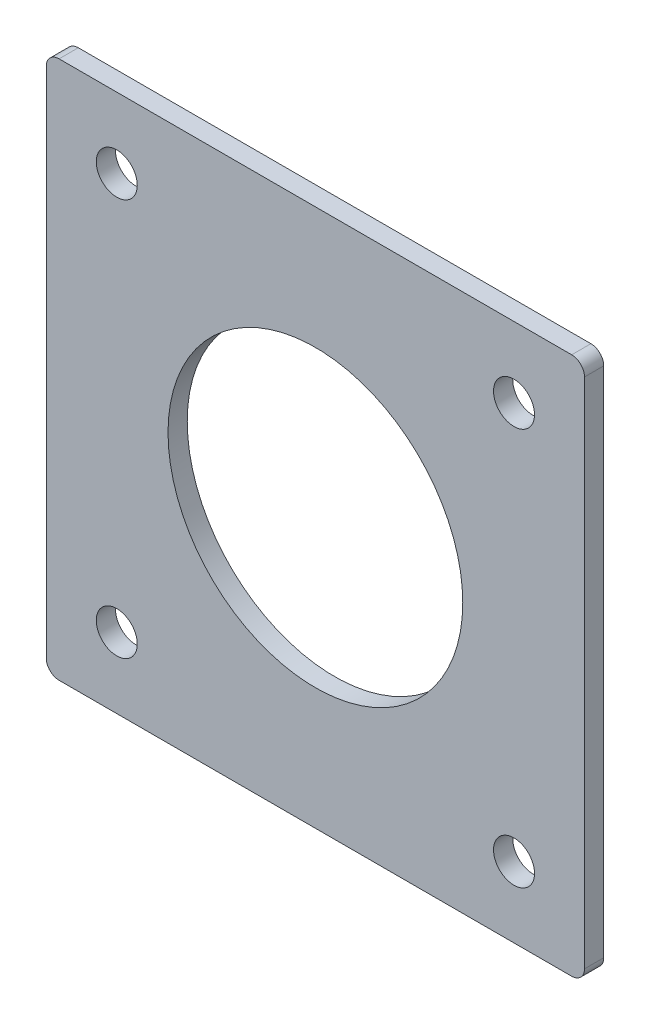
ISO-10303-21;
HEADER;
FILE_DESCRIPTION(('STEP AP214'),'2;1');
FILE_NAME('part.step','',(''),(''),'','','');
FILE_SCHEMA(('AUTOMOTIVE_DESIGN { 1 0 10303 214 1 1 1 1 }'));
ENDSEC;
DATA;
#1=APPLICATION_CONTEXT('core data for automotive mechanical design processes');
#2=APPLICATION_PROTOCOL_DEFINITION('international standard','automotive_design',2000,#1);
#3=PRODUCT_CONTEXT('',#1,'mechanical');
#4=PRODUCT('Part','Part','',(#3));
#5=PRODUCT_RELATED_PRODUCT_CATEGORY('part','',(#4));
#6=PRODUCT_DEFINITION_FORMATION('','',#4);
#7=PRODUCT_DEFINITION_CONTEXT('part definition',#1,'design');
#8=PRODUCT_DEFINITION('design','',#6,#7);
#9=PRODUCT_DEFINITION_SHAPE('','',#8);
#10=(LENGTH_UNIT() NAMED_UNIT(*) SI_UNIT(.MILLI.,.METRE.));
#11=(NAMED_UNIT(*) PLANE_ANGLE_UNIT() SI_UNIT($,.RADIAN.));
#12=(NAMED_UNIT(*) SI_UNIT($,.STERADIAN.) SOLID_ANGLE_UNIT());
#13=UNCERTAINTY_MEASURE_WITH_UNIT(LENGTH_MEASURE(1.E-05),#10,'distance_accuracy_value','');
#14=(GEOMETRIC_REPRESENTATION_CONTEXT(3) GLOBAL_UNCERTAINTY_ASSIGNED_CONTEXT((#13)) GLOBAL_UNIT_ASSIGNED_CONTEXT((#10,
#11,#12)) REPRESENTATION_CONTEXT('',''));
#15=CARTESIAN_POINT('',(0.,0.,0.));
#16=DIRECTION('',(0.,0.,1.));
#17=DIRECTION('',(1.,0.,0.));
#18=AXIS2_PLACEMENT_3D('',#15,#16,#17);
#19=CARTESIAN_POINT('',(0.,0.,1.5));
#20=DIRECTION('',(0.,0.,1.));
#21=DIRECTION('',(1.,0.,0.));
#22=AXIS2_PLACEMENT_3D('',#19,#20,#21);
#23=PLANE('',#22);
#24=CARTESIAN_POINT('',(-7.64179104477614,-10.0149253731343,1.5));
#25=DIRECTION('',(0.,0.,1.));
#26=DIRECTION('',(1.,0.,0.));
#27=AXIS2_PLACEMENT_3D('',#24,#25,#26);
#28=CIRCLE('',#27,1.6);
#29=CARTESIAN_POINT('',(-6.04179104477614,-10.0149253731343,1.5));
#30=VERTEX_POINT('',#29);
#31=EDGE_CURVE('E228',#30,#30,#28,.T.);
#32=ORIENTED_EDGE('',*,*,#31,.F.);
#33=EDGE_LOOP('',(#32));
#34=FACE_BOUND('',#33,.T.);
#35=CARTESIAN_POINT('',(-23.1417910447761,5.48507462686568,1.5));
#36=DIRECTION('',(0.,0.,1.));
#37=DIRECTION('',(1.,0.,0.));
#38=AXIS2_PLACEMENT_3D('',#35,#36,#37);
#39=CIRCLE('',#38,11.5);
#40=CARTESIAN_POINT('',(-11.6417910447761,5.48507462686568,1.5));
#41=VERTEX_POINT('',#40);
#42=EDGE_CURVE('E243',#41,#41,#39,.T.);
#43=ORIENTED_EDGE('',*,*,#42,.F.);
#44=EDGE_LOOP('',(#43));
#45=FACE_BOUND('',#44,.T.);
#46=DIRECTION('',(0.,-1.,0.));
#47=VECTOR('',#46,1.);
#48=CARTESIAN_POINT('',(-44.1417910447761,26.4850746268657,1.5));
#49=LINE('',#48,#47);
#50=CARTESIAN_POINT('',(-44.1417910447761,25.4850746268657,1.5));
#51=VERTEX_POINT('',#50);
#52=CARTESIAN_POINT('',(-44.1417910447761,-14.5149253731343,1.5));
#53=VERTEX_POINT('',#52);
#54=EDGE_CURVE('E148',#51,#53,#49,.T.);
#55=ORIENTED_EDGE('',*,*,#54,.T.);
#56=CARTESIAN_POINT('',(-43.1417910447761,-14.5149253731343,1.5));
#57=DIRECTION('',(0.,0.,1.));
#58=DIRECTION('',(1.,0.,0.));
#59=AXIS2_PLACEMENT_3D('',#56,#57,#58);
#60=CIRCLE('',#59,1.);
#61=CARTESIAN_POINT('',(-43.1417910447761,-15.5149253731343,1.5));
#62=VERTEX_POINT('',#61);
#63=EDGE_CURVE('E172',#53,#62,#60,.T.);
#64=ORIENTED_EDGE('',*,*,#63,.T.);
#65=DIRECTION('',(1.,0.,0.));
#66=VECTOR('',#65,1.);
#67=CARTESIAN_POINT('',(-44.1417910447761,-15.5149253731343,1.5));
#68=LINE('',#67,#66);
#69=CARTESIAN_POINT('',(-3.14179104477613,-15.5149253731343,1.5));
#70=VERTEX_POINT('',#69);
#71=EDGE_CURVE('E125',#62,#70,#68,.T.);
#72=ORIENTED_EDGE('',*,*,#71,.T.);
#73=CARTESIAN_POINT('',(-3.14179104477612,-14.5149253731343,1.5));
#74=DIRECTION('',(0.,0.,1.));
#75=DIRECTION('',(1.,0.,0.));
#76=AXIS2_PLACEMENT_3D('',#73,#74,#75);
#77=CIRCLE('',#76,1.);
#78=CARTESIAN_POINT('',(-2.14179104477612,-14.5149253731343,1.5));
#79=VERTEX_POINT('',#78);
#80=EDGE_CURVE('E169',#70,#79,#77,.T.);
#81=ORIENTED_EDGE('',*,*,#80,.T.);
#82=DIRECTION('',(0.,1.,0.));
#83=VECTOR('',#82,1.);
#84=CARTESIAN_POINT('',(-2.14179104477613,26.4850746268657,1.5));
#85=LINE('',#84,#83);
#86=CARTESIAN_POINT('',(-2.14179104477613,25.4850746268657,1.5));
#87=VERTEX_POINT('',#86);
#88=EDGE_CURVE('E198',#79,#87,#85,.T.);
#89=ORIENTED_EDGE('',*,*,#88,.T.);
#90=CARTESIAN_POINT('',(-3.14179104477613,25.4850746268657,1.5));
#91=DIRECTION('',(0.,0.,1.));
#92=DIRECTION('',(1.,0.,0.));
#93=AXIS2_PLACEMENT_3D('',#90,#91,#92);
#94=CIRCLE('',#93,1.);
#95=CARTESIAN_POINT('',(-3.14179104477615,26.4850746268657,1.5));
#96=VERTEX_POINT('',#95);
#97=EDGE_CURVE('E59',#87,#96,#94,.T.);
#98=ORIENTED_EDGE('',*,*,#97,.T.);
#99=DIRECTION('',(-1.,0.,0.));
#100=VECTOR('',#99,1.);
#101=CARTESIAN_POINT('',(-44.1417910447761,26.4850746268657,1.5));
#102=LINE('',#101,#100);
#103=CARTESIAN_POINT('',(-43.1417910447761,26.4850746268657,1.5));
#104=VERTEX_POINT('',#103);
#105=EDGE_CURVE('E150',#96,#104,#102,.T.);
#106=ORIENTED_EDGE('',*,*,#105,.T.);
#107=CARTESIAN_POINT('',(-43.1417910447761,25.4850746268657,1.5));
#108=DIRECTION('',(0.,0.,1.));
#109=DIRECTION('',(1.,0.,0.));
#110=AXIS2_PLACEMENT_3D('',#107,#108,#109);
#111=CIRCLE('',#110,1.);
#112=EDGE_CURVE('E166',#104,#51,#111,.T.);
#113=ORIENTED_EDGE('',*,*,#112,.T.);
#114=EDGE_LOOP('',(#55,#64,#72,#81,#89,#98,#106,#113));
#115=FACE_BOUND('',#114,.T.);
#116=CARTESIAN_POINT('',(-38.6417910447761,20.9850746268657,1.5));
#117=DIRECTION('',(0.,0.,1.));
#118=DIRECTION('',(1.,0.,0.));
#119=AXIS2_PLACEMENT_3D('',#116,#117,#118);
#120=CIRCLE('',#119,1.6);
#121=CARTESIAN_POINT('',(-37.0417910447761,20.9850746268657,1.5));
#122=VERTEX_POINT('',#121);
#123=EDGE_CURVE('E142',#122,#122,#120,.T.);
#124=ORIENTED_EDGE('',*,*,#123,.F.);
#125=EDGE_LOOP('',(#124));
#126=FACE_BOUND('',#125,.T.);
#127=CARTESIAN_POINT('',(-7.64179104477614,20.9850746268657,1.5));
#128=DIRECTION('',(0.,0.,1.));
#129=DIRECTION('',(-1.,0.,0.));
#130=AXIS2_PLACEMENT_3D('',#127,#128,#129);
#131=CIRCLE('',#130,1.6);
#132=CARTESIAN_POINT('',(-9.24179104477614,20.9850746268657,1.5));
#133=VERTEX_POINT('',#132);
#134=EDGE_CURVE('E216',#133,#133,#131,.T.);
#135=ORIENTED_EDGE('',*,*,#134,.F.);
#136=EDGE_LOOP('',(#135));
#137=FACE_BOUND('',#136,.T.);
#138=CARTESIAN_POINT('',(-38.6417910447761,-10.0149253731343,1.5));
#139=DIRECTION('',(0.,0.,1.));
#140=DIRECTION('',(-1.,0.,0.));
#141=AXIS2_PLACEMENT_3D('',#138,#139,#140);
#142=CIRCLE('',#141,1.6);
#143=CARTESIAN_POINT('',(-40.2417910447761,-10.0149253731343,1.5));
#144=VERTEX_POINT('',#143);
#145=EDGE_CURVE('E219',#144,#144,#142,.T.);
#146=ORIENTED_EDGE('',*,*,#145,.F.);
#147=EDGE_LOOP('',(#146));
#148=FACE_BOUND('',#147,.T.);
#149=ADVANCED_FACE('F38',(#34,#45,#115,#126,#137,#148),#23,.T.);
#150=CARTESIAN_POINT('',(0.,0.,0.));
#151=DIRECTION('',(0.,0.,1.));
#152=DIRECTION('',(1.,0.,0.));
#153=AXIS2_PLACEMENT_3D('',#150,#151,#152);
#154=PLANE('',#153);
#155=DIRECTION('',(1.,0.,0.));
#156=VECTOR('',#155,1.);
#157=CARTESIAN_POINT('',(-44.1417910447761,-15.5149253731343,0.));
#158=LINE('',#157,#156);
#159=CARTESIAN_POINT('',(-43.1417910447761,-15.5149253731343,0.));
#160=VERTEX_POINT('',#159);
#161=CARTESIAN_POINT('',(-3.14179104477613,-15.5149253731343,0.));
#162=VERTEX_POINT('',#161);
#163=EDGE_CURVE('E122',#160,#162,#158,.T.);
#164=ORIENTED_EDGE('',*,*,#163,.F.);
#165=CARTESIAN_POINT('',(-43.1417910447761,-14.5149253731343,0.));
#166=DIRECTION('',(0.,0.,1.));
#167=DIRECTION('',(1.,0.,0.));
#168=AXIS2_PLACEMENT_3D('',#165,#166,#167);
#169=CIRCLE('',#168,1.);
#170=CARTESIAN_POINT('',(-44.1417910447761,-14.5149253731343,0.));
#171=VERTEX_POINT('',#170);
#172=EDGE_CURVE('E104',#160,#171,#169,.F.);
#173=ORIENTED_EDGE('',*,*,#172,.T.);
#174=DIRECTION('',(0.,-1.,0.));
#175=VECTOR('',#174,1.);
#176=CARTESIAN_POINT('',(-44.1417910447761,26.4850746268657,0.));
#177=LINE('',#176,#175);
#178=CARTESIAN_POINT('',(-44.1417910447761,25.4850746268657,0.));
#179=VERTEX_POINT('',#178);
#180=EDGE_CURVE('E135',#179,#171,#177,.T.);
#181=ORIENTED_EDGE('',*,*,#180,.F.);
#182=CARTESIAN_POINT('',(-43.1417910447761,25.4850746268657,0.));
#183=DIRECTION('',(0.,0.,1.));
#184=DIRECTION('',(1.,0.,0.));
#185=AXIS2_PLACEMENT_3D('',#182,#183,#184);
#186=CIRCLE('',#185,1.);
#187=CARTESIAN_POINT('',(-43.1417910447761,26.4850746268657,0.));
#188=VERTEX_POINT('',#187);
#189=EDGE_CURVE('E154',#179,#188,#186,.F.);
#190=ORIENTED_EDGE('',*,*,#189,.T.);
#191=DIRECTION('',(-1.,0.,0.));
#192=VECTOR('',#191,1.);
#193=CARTESIAN_POINT('',(-44.1417910447761,26.4850746268657,0.));
#194=LINE('',#193,#192);
#195=CARTESIAN_POINT('',(-3.14179104477615,26.4850746268657,0.));
#196=VERTEX_POINT('',#195);
#197=EDGE_CURVE('E140',#196,#188,#194,.T.);
#198=ORIENTED_EDGE('',*,*,#197,.F.);
#199=CARTESIAN_POINT('',(-3.14179104477613,25.4850746268657,0.));
#200=DIRECTION('',(0.,0.,1.));
#201=DIRECTION('',(1.,0.,0.));
#202=AXIS2_PLACEMENT_3D('',#199,#200,#201);
#203=CIRCLE('',#202,1.);
#204=CARTESIAN_POINT('',(-2.14179104477613,25.4850746268657,0.));
#205=VERTEX_POINT('',#204);
#206=EDGE_CURVE('E127',#196,#205,#203,.F.);
#207=ORIENTED_EDGE('',*,*,#206,.T.);
#208=DIRECTION('',(0.,1.,0.));
#209=VECTOR('',#208,1.);
#210=CARTESIAN_POINT('',(-2.14179104477613,26.4850746268657,0.));
#211=LINE('',#210,#209);
#212=CARTESIAN_POINT('',(-2.14179104477612,-14.5149253731343,0.));
#213=VERTEX_POINT('',#212);
#214=EDGE_CURVE('E134',#213,#205,#211,.T.);
#215=ORIENTED_EDGE('',*,*,#214,.F.);
#216=CARTESIAN_POINT('',(-3.14179104477612,-14.5149253731343,0.));
#217=DIRECTION('',(0.,0.,1.));
#218=DIRECTION('',(1.,0.,0.));
#219=AXIS2_PLACEMENT_3D('',#216,#217,#218);
#220=CIRCLE('',#219,1.);
#221=EDGE_CURVE('E116',#213,#162,#220,.F.);
#222=ORIENTED_EDGE('',*,*,#221,.T.);
#223=EDGE_LOOP('',(#164,#173,#181,#190,#198,#207,#215,#222));
#224=FACE_BOUND('',#223,.T.);
#225=CARTESIAN_POINT('',(-38.6417910447761,20.9850746268657,0.));
#226=DIRECTION('',(0.,0.,1.));
#227=DIRECTION('',(1.,0.,0.));
#228=AXIS2_PLACEMENT_3D('',#225,#226,#227);
#229=CIRCLE('',#228,1.6);
#230=CARTESIAN_POINT('',(-37.0417910447761,20.9850746268657,0.));
#231=VERTEX_POINT('',#230);
#232=EDGE_CURVE('E201',#231,#231,#229,.T.);
#233=ORIENTED_EDGE('',*,*,#232,.T.);
#234=EDGE_LOOP('',(#233));
#235=FACE_BOUND('',#234,.T.);
#236=CARTESIAN_POINT('',(-23.1417910447761,5.48507462686568,0.));
#237=DIRECTION('',(0.,0.,1.));
#238=DIRECTION('',(1.,0.,0.));
#239=AXIS2_PLACEMENT_3D('',#236,#237,#238);
#240=CIRCLE('',#239,11.5);
#241=CARTESIAN_POINT('',(-11.6417910447761,5.48507462686568,0.));
#242=VERTEX_POINT('',#241);
#243=EDGE_CURVE('E239',#242,#242,#240,.T.);
#244=ORIENTED_EDGE('',*,*,#243,.T.);
#245=EDGE_LOOP('',(#244));
#246=FACE_BOUND('',#245,.T.);
#247=CARTESIAN_POINT('',(-7.64179104477614,20.9850746268657,0.));
#248=DIRECTION('',(0.,0.,1.));
#249=DIRECTION('',(-1.,0.,0.));
#250=AXIS2_PLACEMENT_3D('',#247,#248,#249);
#251=CIRCLE('',#250,1.6);
#252=CARTESIAN_POINT('',(-9.24179104477614,20.9850746268657,0.));
#253=VERTEX_POINT('',#252);
#254=EDGE_CURVE('E235',#253,#253,#251,.T.);
#255=ORIENTED_EDGE('',*,*,#254,.T.);
#256=EDGE_LOOP('',(#255));
#257=FACE_BOUND('',#256,.T.);
#258=CARTESIAN_POINT('',(-7.64179104477614,-10.0149253731343,0.));
#259=DIRECTION('',(0.,0.,1.));
#260=DIRECTION('',(1.,0.,0.));
#261=AXIS2_PLACEMENT_3D('',#258,#259,#260);
#262=CIRCLE('',#261,1.6);
#263=CARTESIAN_POINT('',(-6.04179104477614,-10.0149253731343,0.));
#264=VERTEX_POINT('',#263);
#265=EDGE_CURVE('E222',#264,#264,#262,.T.);
#266=ORIENTED_EDGE('',*,*,#265,.T.);
#267=EDGE_LOOP('',(#266));
#268=FACE_BOUND('',#267,.T.);
#269=CARTESIAN_POINT('',(-38.6417910447761,-10.0149253731343,0.));
#270=DIRECTION('',(0.,0.,1.));
#271=DIRECTION('',(-1.,0.,0.));
#272=AXIS2_PLACEMENT_3D('',#269,#270,#271);
#273=CIRCLE('',#272,1.6);
#274=CARTESIAN_POINT('',(-40.2417910447761,-10.0149253731343,0.));
#275=VERTEX_POINT('',#274);
#276=EDGE_CURVE('E223',#275,#275,#273,.T.);
#277=ORIENTED_EDGE('',*,*,#276,.T.);
#278=EDGE_LOOP('',(#277));
#279=FACE_BOUND('',#278,.T.);
#280=ADVANCED_FACE('F130',(#224,#235,#246,#257,#268,#279),#154,.F.);
#281=CARTESIAN_POINT('',(-44.1417910447761,26.4850746268657,1.5));
#282=DIRECTION('',(1.,0.,0.));
#283=DIRECTION('',(0.,0.,-1.));
#284=AXIS2_PLACEMENT_3D('',#281,#282,#283);
#285=PLANE('',#284);
#286=ORIENTED_EDGE('',*,*,#180,.T.);
#287=DIRECTION('',(0.,0.,-1.));
#288=VECTOR('',#287,1.);
#289=CARTESIAN_POINT('',(-44.1417910447761,-14.5149253731343,1.5));
#290=LINE('',#289,#288);
#291=EDGE_CURVE('E109',#171,#53,#290,.F.);
#292=ORIENTED_EDGE('',*,*,#291,.T.);
#293=ORIENTED_EDGE('',*,*,#54,.F.);
#294=DIRECTION('',(0.,0.,-1.));
#295=VECTOR('',#294,1.);
#296=CARTESIAN_POINT('',(-44.1417910447761,25.4850746268657,1.5));
#297=LINE('',#296,#295);
#298=EDGE_CURVE('E115',#51,#179,#297,.T.);
#299=ORIENTED_EDGE('',*,*,#298,.T.);
#300=EDGE_LOOP('',(#286,#292,#293,#299));
#301=FACE_BOUND('',#300,.T.);
#302=ADVANCED_FACE('F193',(#301),#285,.F.);
#303=CARTESIAN_POINT('',(-44.1417910447761,-15.5149253731343,1.5));
#304=DIRECTION('',(0.,1.,0.));
#305=DIRECTION('',(-1.,0.,0.));
#306=AXIS2_PLACEMENT_3D('',#303,#304,#305);
#307=PLANE('',#306);
#308=ORIENTED_EDGE('',*,*,#71,.F.);
#309=DIRECTION('',(0.,0.,-1.));
#310=VECTOR('',#309,1.);
#311=CARTESIAN_POINT('',(-43.1417910447761,-15.5149253731343,1.5));
#312=LINE('',#311,#310);
#313=EDGE_CURVE('E108',#62,#160,#312,.T.);
#314=ORIENTED_EDGE('',*,*,#313,.T.);
#315=ORIENTED_EDGE('',*,*,#163,.T.);
#316=DIRECTION('',(0.,0.,-1.));
#317=VECTOR('',#316,1.);
#318=CARTESIAN_POINT('',(-3.14179104477613,-15.5149253731343,1.5));
#319=LINE('',#318,#317);
#320=EDGE_CURVE('E128',#162,#70,#319,.F.);
#321=ORIENTED_EDGE('',*,*,#320,.T.);
#322=EDGE_LOOP('',(#308,#314,#315,#321));
#323=FACE_BOUND('',#322,.T.);
#324=ADVANCED_FACE('F121',(#323),#307,.F.);
#325=CARTESIAN_POINT('',(-2.14179104477613,26.4850746268657,1.5));
#326=DIRECTION('',(-1.,0.,0.));
#327=DIRECTION('',(0.,-1.,0.));
#328=AXIS2_PLACEMENT_3D('',#325,#326,#327);
#329=PLANE('',#328);
#330=ORIENTED_EDGE('',*,*,#88,.F.);
#331=DIRECTION('',(0.,0.,-1.));
#332=VECTOR('',#331,1.);
#333=CARTESIAN_POINT('',(-2.14179104477612,-14.5149253731343,1.5));
#334=LINE('',#333,#332);
#335=EDGE_CURVE('E178',#79,#213,#334,.T.);
#336=ORIENTED_EDGE('',*,*,#335,.T.);
#337=ORIENTED_EDGE('',*,*,#214,.T.);
#338=DIRECTION('',(0.,0.,-1.));
#339=VECTOR('',#338,1.);
#340=CARTESIAN_POINT('',(-2.14179104477613,25.4850746268657,1.5));
#341=LINE('',#340,#339);
#342=EDGE_CURVE('E175',#205,#87,#341,.F.);
#343=ORIENTED_EDGE('',*,*,#342,.T.);
#344=EDGE_LOOP('',(#330,#336,#337,#343));
#345=FACE_BOUND('',#344,.T.);
#346=ADVANCED_FACE('F268',(#345),#329,.F.);
#347=CARTESIAN_POINT('',(-44.1417910447761,26.4850746268657,1.5));
#348=DIRECTION('',(0.,-1.,0.));
#349=DIRECTION('',(0.,0.,-1.));
#350=AXIS2_PLACEMENT_3D('',#347,#348,#349);
#351=PLANE('',#350);
#352=ORIENTED_EDGE('',*,*,#197,.T.);
#353=DIRECTION('',(0.,0.,-1.));
#354=VECTOR('',#353,1.);
#355=CARTESIAN_POINT('',(-43.1417910447761,26.4850746268657,1.5));
#356=LINE('',#355,#354);
#357=EDGE_CURVE('E11',#188,#104,#356,.F.);
#358=ORIENTED_EDGE('',*,*,#357,.T.);
#359=ORIENTED_EDGE('',*,*,#105,.F.);
#360=DIRECTION('',(0.,0.,-1.));
#361=VECTOR('',#360,1.);
#362=CARTESIAN_POINT('',(-3.14179104477613,26.4850746268657,1.5));
#363=LINE('',#362,#361);
#364=EDGE_CURVE('E47',#96,#196,#363,.T.);
#365=ORIENTED_EDGE('',*,*,#364,.T.);
#366=EDGE_LOOP('',(#352,#358,#359,#365));
#367=FACE_BOUND('',#366,.T.);
#368=ADVANCED_FACE('F185',(#367),#351,.F.);
#369=CARTESIAN_POINT('',(-38.6417910447761,20.9850746268657,1.5));
#370=DIRECTION('',(0.,0.,-1.));
#371=DIRECTION('',(-1.,0.,0.));
#372=AXIS2_PLACEMENT_3D('',#369,#370,#371);
#373=CYLINDRICAL_SURFACE('',#372,1.6);
#374=ORIENTED_EDGE('',*,*,#123,.T.);
#375=EDGE_LOOP('',(#374));
#376=FACE_BOUND('',#375,.T.);
#377=ORIENTED_EDGE('',*,*,#232,.F.);
#378=EDGE_LOOP('',(#377));
#379=FACE_BOUND('',#378,.T.);
#380=ADVANCED_FACE('F256',(#376,#379),#373,.F.);
#381=CARTESIAN_POINT('',(-23.1417910447761,5.48507462686568,1.5));
#382=DIRECTION('',(0.,0.,-1.));
#383=DIRECTION('',(-1.,0.,0.));
#384=AXIS2_PLACEMENT_3D('',#381,#382,#383);
#385=CYLINDRICAL_SURFACE('',#384,11.5);
#386=ORIENTED_EDGE('',*,*,#42,.T.);
#387=EDGE_LOOP('',(#386));
#388=FACE_BOUND('',#387,.T.);
#389=ORIENTED_EDGE('',*,*,#243,.F.);
#390=EDGE_LOOP('',(#389));
#391=FACE_BOUND('',#390,.T.);
#392=ADVANCED_FACE('F258',(#388,#391),#385,.F.);
#393=CARTESIAN_POINT('',(-7.64179104477614,20.9850746268657,1.5));
#394=DIRECTION('',(0.,0.,-1.));
#395=DIRECTION('',(-1.,0.,0.));
#396=AXIS2_PLACEMENT_3D('',#393,#394,#395);
#397=CYLINDRICAL_SURFACE('',#396,1.6);
#398=ORIENTED_EDGE('',*,*,#134,.T.);
#399=EDGE_LOOP('',(#398));
#400=FACE_BOUND('',#399,.T.);
#401=ORIENTED_EDGE('',*,*,#254,.F.);
#402=EDGE_LOOP('',(#401));
#403=FACE_BOUND('',#402,.T.);
#404=ADVANCED_FACE('F264',(#400,#403),#397,.F.);
#405=CARTESIAN_POINT('',(-7.64179104477614,-10.0149253731343,1.5));
#406=DIRECTION('',(0.,0.,-1.));
#407=DIRECTION('',(-1.,0.,0.));
#408=AXIS2_PLACEMENT_3D('',#405,#406,#407);
#409=CYLINDRICAL_SURFACE('',#408,1.6);
#410=ORIENTED_EDGE('',*,*,#31,.T.);
#411=EDGE_LOOP('',(#410));
#412=FACE_BOUND('',#411,.T.);
#413=ORIENTED_EDGE('',*,*,#265,.F.);
#414=EDGE_LOOP('',(#413));
#415=FACE_BOUND('',#414,.T.);
#416=ADVANCED_FACE('F345',(#412,#415),#409,.F.);
#417=CARTESIAN_POINT('',(-38.6417910447761,-10.0149253731343,1.5));
#418=DIRECTION('',(0.,0.,-1.));
#419=DIRECTION('',(-1.,0.,0.));
#420=AXIS2_PLACEMENT_3D('',#417,#418,#419);
#421=CYLINDRICAL_SURFACE('',#420,1.6);
#422=ORIENTED_EDGE('',*,*,#145,.T.);
#423=EDGE_LOOP('',(#422));
#424=FACE_BOUND('',#423,.T.);
#425=ORIENTED_EDGE('',*,*,#276,.F.);
#426=EDGE_LOOP('',(#425));
#427=FACE_BOUND('',#426,.T.);
#428=ADVANCED_FACE('F284',(#424,#427),#421,.F.);
#429=CARTESIAN_POINT('',(-43.1417910447761,-14.5149253731343,1.5));
#430=DIRECTION('',(0.,0.,-1.));
#431=DIRECTION('',(-1.,0.,0.));
#432=AXIS2_PLACEMENT_3D('',#429,#430,#431);
#433=CYLINDRICAL_SURFACE('',#432,1.);
#434=ORIENTED_EDGE('',*,*,#63,.F.);
#435=ORIENTED_EDGE('',*,*,#291,.F.);
#436=ORIENTED_EDGE('',*,*,#172,.F.);
#437=ORIENTED_EDGE('',*,*,#313,.F.);
#438=EDGE_LOOP('',(#434,#435,#436,#437));
#439=FACE_BOUND('',#438,.T.);
#440=ADVANCED_FACE('F107',(#439),#433,.T.);
#441=CARTESIAN_POINT('',(-3.14179104477612,-14.5149253731343,1.5));
#442=DIRECTION('',(0.,0.,-1.));
#443=DIRECTION('',(-1.,0.,0.));
#444=AXIS2_PLACEMENT_3D('',#441,#442,#443);
#445=CYLINDRICAL_SURFACE('',#444,1.);
#446=ORIENTED_EDGE('',*,*,#80,.F.);
#447=ORIENTED_EDGE('',*,*,#320,.F.);
#448=ORIENTED_EDGE('',*,*,#221,.F.);
#449=ORIENTED_EDGE('',*,*,#335,.F.);
#450=EDGE_LOOP('',(#446,#447,#448,#449));
#451=FACE_BOUND('',#450,.T.);
#452=ADVANCED_FACE('F283',(#451),#445,.T.);
#453=CARTESIAN_POINT('',(-43.1417910447761,25.4850746268657,1.5));
#454=DIRECTION('',(0.,0.,-1.));
#455=DIRECTION('',(-1.,0.,0.));
#456=AXIS2_PLACEMENT_3D('',#453,#454,#455);
#457=CYLINDRICAL_SURFACE('',#456,1.);
#458=ORIENTED_EDGE('',*,*,#112,.F.);
#459=ORIENTED_EDGE('',*,*,#357,.F.);
#460=ORIENTED_EDGE('',*,*,#189,.F.);
#461=ORIENTED_EDGE('',*,*,#298,.F.);
#462=EDGE_LOOP('',(#458,#459,#460,#461));
#463=FACE_BOUND('',#462,.T.);
#464=ADVANCED_FACE('F190',(#463),#457,.T.);
#465=CARTESIAN_POINT('',(-3.14179104477613,25.4850746268657,1.5));
#466=DIRECTION('',(0.,0.,-1.));
#467=DIRECTION('',(-1.,0.,0.));
#468=AXIS2_PLACEMENT_3D('',#465,#466,#467);
#469=CYLINDRICAL_SURFACE('',#468,1.);
#470=ORIENTED_EDGE('',*,*,#97,.F.);
#471=ORIENTED_EDGE('',*,*,#342,.F.);
#472=ORIENTED_EDGE('',*,*,#206,.F.);
#473=ORIENTED_EDGE('',*,*,#364,.F.);
#474=EDGE_LOOP('',(#470,#471,#472,#473));
#475=FACE_BOUND('',#474,.T.);
#476=ADVANCED_FACE('F40',(#475),#469,.T.);
#477=CLOSED_SHELL('',(#149,#280,#302,#324,#346,#368,#380,#392,#404,#416,#428,#440,#452,#464,#476));
#478=MANIFOLD_SOLID_BREP('B2',#477);
#479=ADVANCED_BREP_SHAPE_REPRESENTATION('',(#18,#478),#14);
#480=SHAPE_DEFINITION_REPRESENTATION(#9,#479);
ENDSEC;
END-ISO-10303-21;
